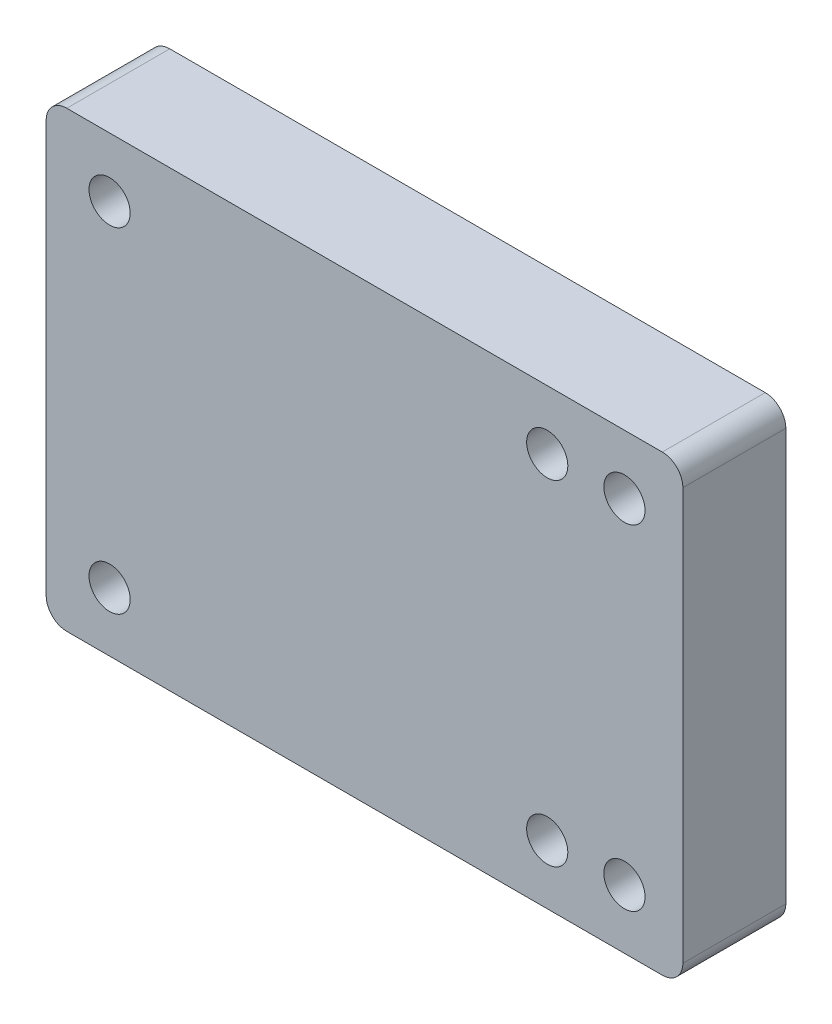
ISO-10303-21;
HEADER;
FILE_DESCRIPTION(('STEP AP214'),'2;1');
FILE_NAME('part.step','',(''),(''),'','','');
FILE_SCHEMA(('AUTOMOTIVE_DESIGN { 1 0 10303 214 1 1 1 1 }'));
ENDSEC;
DATA;
#1=APPLICATION_CONTEXT('core data for automotive mechanical design processes');
#2=APPLICATION_PROTOCOL_DEFINITION('international standard','automotive_design',2000,#1);
#3=PRODUCT_CONTEXT('',#1,'mechanical');
#4=PRODUCT('Part','Part','',(#3));
#5=PRODUCT_RELATED_PRODUCT_CATEGORY('part','',(#4));
#6=PRODUCT_DEFINITION_FORMATION('','',#4);
#7=PRODUCT_DEFINITION_CONTEXT('part definition',#1,'design');
#8=PRODUCT_DEFINITION('design','',#6,#7);
#9=PRODUCT_DEFINITION_SHAPE('','',#8);
#10=(LENGTH_UNIT() NAMED_UNIT(*) SI_UNIT(.MILLI.,.METRE.));
#11=(NAMED_UNIT(*) PLANE_ANGLE_UNIT() SI_UNIT($,.RADIAN.));
#12=(NAMED_UNIT(*) SI_UNIT($,.STERADIAN.) SOLID_ANGLE_UNIT());
#13=UNCERTAINTY_MEASURE_WITH_UNIT(LENGTH_MEASURE(1.E-05),#10,'distance_accuracy_value','');
#14=(GEOMETRIC_REPRESENTATION_CONTEXT(3) GLOBAL_UNCERTAINTY_ASSIGNED_CONTEXT((#13)) GLOBAL_UNIT_ASSIGNED_CONTEXT((#10,
#11,#12)) REPRESENTATION_CONTEXT('',''));
#15=CARTESIAN_POINT('',(0.,0.,0.));
#16=DIRECTION('',(0.,0.,1.));
#17=DIRECTION('',(1.,0.,0.));
#18=AXIS2_PLACEMENT_3D('',#15,#16,#17);
#19=CARTESIAN_POINT('',(4.85393581005026E-13,128.439999999993,12.7));
#20=DIRECTION('',(0.,-1.,0.));
#21=DIRECTION('',(1.,0.,0.));
#22=AXIS2_PLACEMENT_3D('',#19,#20,#21);
#23=PLANE('',#22);
#24=DIRECTION('',(-1.,0.,0.));
#25=VECTOR('',#24,1.);
#26=CARTESIAN_POINT('',(4.85393581005026E-13,128.439999999993,0.));
#27=LINE('',#26,#25);
#28=CARTESIAN_POINT('',(120.167455722645,128.439999999993,0.));
#29=VERTEX_POINT('',#28);
#30=CARTESIAN_POINT('',(46.7234244956583,128.439999999993,0.));
#31=VERTEX_POINT('',#30);
#32=EDGE_CURVE('E150',#29,#31,#27,.T.);
#33=ORIENTED_EDGE('',*,*,#32,.T.);
#34=DIRECTION('',(0.,0.,-1.));
#35=VECTOR('',#34,1.);
#36=CARTESIAN_POINT('',(46.7234244956583,128.439999999993,12.7));
#37=LINE('',#36,#35);
#38=CARTESIAN_POINT('',(46.7234244956583,128.439999999993,12.7));
#39=VERTEX_POINT('',#38);
#40=EDGE_CURVE('E11',#39,#31,#37,.T.);
#41=ORIENTED_EDGE('',*,*,#40,.F.);
#42=DIRECTION('',(-1.,0.,0.));
#43=VECTOR('',#42,1.);
#44=CARTESIAN_POINT('',(4.85393581005026E-13,128.439999999993,12.7));
#45=LINE('',#44,#43);
#46=CARTESIAN_POINT('',(120.167455722645,128.439999999993,12.7));
#47=VERTEX_POINT('',#46);
#48=EDGE_CURVE('E210',#47,#39,#45,.T.);
#49=ORIENTED_EDGE('',*,*,#48,.F.);
#50=DIRECTION('',(0.,0.,-1.));
#51=VECTOR('',#50,1.);
#52=CARTESIAN_POINT('',(120.167455722645,128.439999999993,12.7));
#53=LINE('',#52,#51);
#54=EDGE_CURVE('E128',#47,#29,#53,.T.);
#55=ORIENTED_EDGE('',*,*,#54,.T.);
#56=EDGE_LOOP('',(#33,#41,#49,#55));
#57=FACE_BOUND('',#56,.T.);
#58=ADVANCED_FACE('F35',(#57),#23,.F.);
#59=CARTESIAN_POINT('',(46.7234244956582,125.899999999993,12.7));
#60=DIRECTION('',(0.,0.,1.));
#61=DIRECTION('',(1.,0.,0.));
#62=AXIS2_PLACEMENT_3D('',#59,#60,#61);
#63=ELLIPSE('',#62,2.54348575883472,2.53999999999999);
#64=DIRECTION('',(0.,0.,-1.));
#65=VECTOR('',#64,1.);
#66=SURFACE_OF_LINEAR_EXTRUSION('',#63,#65);
#67=CARTESIAN_POINT('',(46.7234244956582,125.899999999993,0.));
#68=DIRECTION('',(0.,0.,1.));
#69=DIRECTION('',(1.,0.,0.));
#70=AXIS2_PLACEMENT_3D('',#67,#68,#69);
#71=ELLIPSE('',#70,2.54348575883472,2.53999999999999);
#72=CARTESIAN_POINT('',(44.1799387368235,125.899999999993,0.));
#73=VERTEX_POINT('',#72);
#74=EDGE_CURVE('E153',#31,#73,#71,.T.);
#75=ORIENTED_EDGE('',*,*,#74,.T.);
#76=DIRECTION('',(0.,0.,-1.));
#77=VECTOR('',#76,1.);
#78=CARTESIAN_POINT('',(44.1799387368235,125.899999999993,12.7));
#79=LINE('',#78,#77);
#80=CARTESIAN_POINT('',(44.1799387368235,125.899999999993,12.7));
#81=VERTEX_POINT('',#80);
#82=EDGE_CURVE('E44',#81,#73,#79,.T.);
#83=ORIENTED_EDGE('',*,*,#82,.F.);
#84=EDGE_CURVE('E95',#39,#81,#63,.T.);
#85=ORIENTED_EDGE('',*,*,#84,.F.);
#86=ORIENTED_EDGE('',*,*,#40,.T.);
#87=EDGE_LOOP('',(#75,#83,#85,#86));
#88=FACE_BOUND('',#87,.T.);
#89=ADVANCED_FACE('F180',(#88),#66,.F.);
#90=CARTESIAN_POINT('',(44.179938736823,-1.6897002779776E-13,12.7));
#91=DIRECTION('',(-1.,0.,0.));
#92=DIRECTION('',(0.,-1.,0.));
#93=AXIS2_PLACEMENT_3D('',#90,#91,#92);
#94=PLANE('',#93);
#95=DIRECTION('',(0.,1.,0.));
#96=VECTOR('',#95,1.);
#97=CARTESIAN_POINT('',(44.179938736823,-1.6897002779776E-13,0.));
#98=LINE('',#97,#96);
#99=CARTESIAN_POINT('',(44.1799387368233,75.0999999999933,0.));
#100=VERTEX_POINT('',#99);
#101=EDGE_CURVE('E156',#100,#73,#98,.T.);
#102=ORIENTED_EDGE('',*,*,#101,.F.);
#103=DIRECTION('',(0.,0.,-1.));
#104=VECTOR('',#103,1.);
#105=CARTESIAN_POINT('',(44.1799387368233,75.0999999999933,12.7));
#106=LINE('',#105,#104);
#107=CARTESIAN_POINT('',(44.1799387368233,75.0999999999933,12.7));
#108=VERTEX_POINT('',#107);
#109=EDGE_CURVE('E173',#108,#100,#106,.T.);
#110=ORIENTED_EDGE('',*,*,#109,.F.);
#111=DIRECTION('',(0.,1.,0.));
#112=VECTOR('',#111,1.);
#113=CARTESIAN_POINT('',(44.179938736823,-1.6897002779776E-13,12.7));
#114=LINE('',#113,#112);
#115=EDGE_CURVE('E179',#108,#81,#114,.T.);
#116=ORIENTED_EDGE('',*,*,#115,.T.);
#117=ORIENTED_EDGE('',*,*,#82,.T.);
#118=EDGE_LOOP('',(#102,#110,#116,#117));
#119=FACE_BOUND('',#118,.T.);
#120=ADVANCED_FACE('F177',(#119),#94,.T.);
#121=CARTESIAN_POINT('',(46.7234244956581,75.0999999999933,12.7));
#122=DIRECTION('',(0.,0.,1.));
#123=DIRECTION('',(1.,0.,0.));
#124=AXIS2_PLACEMENT_3D('',#121,#122,#123);
#125=ELLIPSE('',#124,2.54348575883472,2.54);
#126=DIRECTION('',(0.,0.,-1.));
#127=VECTOR('',#126,1.);
#128=SURFACE_OF_LINEAR_EXTRUSION('',#125,#127);
#129=CARTESIAN_POINT('',(46.7234244956581,75.0999999999933,0.));
#130=DIRECTION('',(0.,0.,1.));
#131=DIRECTION('',(1.,0.,0.));
#132=AXIS2_PLACEMENT_3D('',#129,#130,#131);
#133=ELLIPSE('',#132,2.54348575883472,2.54);
#134=CARTESIAN_POINT('',(46.723424495658,72.5599999999933,0.));
#135=VERTEX_POINT('',#134);
#136=EDGE_CURVE('E159',#100,#135,#133,.T.);
#137=ORIENTED_EDGE('',*,*,#136,.T.);
#138=DIRECTION('',(0.,0.,-1.));
#139=VECTOR('',#138,1.);
#140=CARTESIAN_POINT('',(46.723424495658,72.5599999999933,12.7));
#141=LINE('',#140,#139);
#142=CARTESIAN_POINT('',(46.723424495658,72.5599999999933,12.7));
#143=VERTEX_POINT('',#142);
#144=EDGE_CURVE('E170',#143,#135,#141,.T.);
#145=ORIENTED_EDGE('',*,*,#144,.F.);
#146=EDGE_CURVE('E193',#108,#143,#125,.T.);
#147=ORIENTED_EDGE('',*,*,#146,.F.);
#148=ORIENTED_EDGE('',*,*,#109,.T.);
#149=EDGE_LOOP('',(#137,#145,#147,#148));
#150=FACE_BOUND('',#149,.T.);
#151=ADVANCED_FACE('F189',(#150),#128,.F.);
#152=CARTESIAN_POINT('',(2.87925616238006E-13,72.5599999999934,12.7));
#153=DIRECTION('',(0.,1.,0.));
#154=DIRECTION('',(-1.,0.,0.));
#155=AXIS2_PLACEMENT_3D('',#152,#153,#154);
#156=PLANE('',#155);
#157=DIRECTION('',(1.,0.,0.));
#158=VECTOR('',#157,1.);
#159=CARTESIAN_POINT('',(2.87925616238006E-13,72.5599999999934,0.));
#160=LINE('',#159,#158);
#161=CARTESIAN_POINT('',(120.167455722645,72.559999999993,0.));
#162=VERTEX_POINT('',#161);
#163=EDGE_CURVE('E161',#135,#162,#160,.T.);
#164=ORIENTED_EDGE('',*,*,#163,.T.);
#165=DIRECTION('',(0.,0.,-1.));
#166=VECTOR('',#165,1.);
#167=CARTESIAN_POINT('',(120.167455722645,72.559999999993,12.7));
#168=LINE('',#167,#166);
#169=CARTESIAN_POINT('',(120.167455722645,72.559999999993,12.7));
#170=VERTEX_POINT('',#169);
#171=EDGE_CURVE('E123',#170,#162,#168,.T.);
#172=ORIENTED_EDGE('',*,*,#171,.F.);
#173=DIRECTION('',(1.,0.,0.));
#174=VECTOR('',#173,1.);
#175=CARTESIAN_POINT('',(2.87925616238006E-13,72.5599999999934,12.7));
#176=LINE('',#175,#174);
#177=EDGE_CURVE('E114',#143,#170,#176,.T.);
#178=ORIENTED_EDGE('',*,*,#177,.F.);
#179=ORIENTED_EDGE('',*,*,#144,.T.);
#180=EDGE_LOOP('',(#164,#172,#178,#179));
#181=FACE_BOUND('',#180,.T.);
#182=ADVANCED_FACE('F192',(#181),#156,.F.);
#183=CARTESIAN_POINT('',(120.167455722645,75.099999999993,12.7));
#184=DIRECTION('',(0.,0.,-1.));
#185=DIRECTION('',(-1.,0.,0.));
#186=AXIS2_PLACEMENT_3D('',#183,#184,#185);
#187=CYLINDRICAL_SURFACE('',#186,2.54000000000001);
#188=CARTESIAN_POINT('',(120.167455722645,75.099999999993,0.));
#189=DIRECTION('',(0.,0.,1.));
#190=DIRECTION('',(1.,0.,0.));
#191=AXIS2_PLACEMENT_3D('',#188,#189,#190);
#192=CIRCLE('',#191,2.54000000000001);
#193=CARTESIAN_POINT('',(122.707455722645,75.0999999999929,0.));
#194=VERTEX_POINT('',#193);
#195=EDGE_CURVE('E122',#162,#194,#192,.T.);
#196=ORIENTED_EDGE('',*,*,#195,.T.);
#197=DIRECTION('',(0.,0.,-1.));
#198=VECTOR('',#197,1.);
#199=CARTESIAN_POINT('',(122.707455722645,75.0999999999929,12.7));
#200=LINE('',#199,#198);
#201=CARTESIAN_POINT('',(122.707455722645,75.0999999999929,12.7));
#202=VERTEX_POINT('',#201);
#203=EDGE_CURVE('E119',#202,#194,#200,.T.);
#204=ORIENTED_EDGE('',*,*,#203,.F.);
#205=CARTESIAN_POINT('',(120.167455722645,75.099999999993,12.7));
#206=DIRECTION('',(0.,0.,1.));
#207=DIRECTION('',(1.,0.,0.));
#208=AXIS2_PLACEMENT_3D('',#205,#206,#207);
#209=CIRCLE('',#208,2.54000000000001);
#210=EDGE_CURVE('E108',#170,#202,#209,.T.);
#211=ORIENTED_EDGE('',*,*,#210,.F.);
#212=ORIENTED_EDGE('',*,*,#171,.T.);
#213=EDGE_LOOP('',(#196,#204,#211,#212));
#214=FACE_BOUND('',#213,.T.);
#215=ADVANCED_FACE('F120',(#214),#187,.T.);
#216=CARTESIAN_POINT('',(122.707455722644,-4.69305363412973E-13,12.7));
#217=DIRECTION('',(-1.,0.,0.));
#218=DIRECTION('',(0.,-1.,0.));
#219=AXIS2_PLACEMENT_3D('',#216,#217,#218);
#220=PLANE('',#219);
#221=DIRECTION('',(0.,1.,0.));
#222=VECTOR('',#221,1.);
#223=CARTESIAN_POINT('',(122.707455722644,-4.69305363412973E-13,0.));
#224=LINE('',#223,#222);
#225=CARTESIAN_POINT('',(122.707455722645,125.899999999993,0.));
#226=VERTEX_POINT('',#225);
#227=EDGE_CURVE('E81',#194,#226,#224,.T.);
#228=ORIENTED_EDGE('',*,*,#227,.T.);
#229=DIRECTION('',(0.,0.,-1.));
#230=VECTOR('',#229,1.);
#231=CARTESIAN_POINT('',(122.707455722645,125.899999999993,12.7));
#232=LINE('',#231,#230);
#233=CARTESIAN_POINT('',(122.707455722645,125.899999999993,12.7));
#234=VERTEX_POINT('',#233);
#235=EDGE_CURVE('E124',#234,#226,#232,.T.);
#236=ORIENTED_EDGE('',*,*,#235,.F.);
#237=DIRECTION('',(0.,1.,0.));
#238=VECTOR('',#237,1.);
#239=CARTESIAN_POINT('',(122.707455722644,-4.69305363412973E-13,12.7));
#240=LINE('',#239,#238);
#241=EDGE_CURVE('E112',#202,#234,#240,.T.);
#242=ORIENTED_EDGE('',*,*,#241,.F.);
#243=ORIENTED_EDGE('',*,*,#203,.T.);
#244=EDGE_LOOP('',(#228,#236,#242,#243));
#245=FACE_BOUND('',#244,.T.);
#246=ADVANCED_FACE('F126',(#245),#220,.F.);
#247=CARTESIAN_POINT('',(52.0031387368233,79.8624999999932,12.7));
#248=DIRECTION('',(0.,0.,-1.));
#249=DIRECTION('',(-1.,0.,0.));
#250=AXIS2_PLACEMENT_3D('',#247,#248,#249);
#251=CYLINDRICAL_SURFACE('',#250,2.54);
#252=CARTESIAN_POINT('',(52.0031387368233,79.8624999999932,12.7));
#253=DIRECTION('',(0.,0.,1.));
#254=DIRECTION('',(1.,0.,0.));
#255=AXIS2_PLACEMENT_3D('',#252,#253,#254);
#256=CIRCLE('',#255,2.54);
#257=CARTESIAN_POINT('',(54.5431387368233,79.8624999999932,12.7));
#258=VERTEX_POINT('',#257);
#259=EDGE_CURVE('E212',#258,#258,#256,.T.);
#260=ORIENTED_EDGE('',*,*,#259,.T.);
#261=EDGE_LOOP('',(#260));
#262=FACE_BOUND('',#261,.T.);
#263=CARTESIAN_POINT('',(52.0031387368233,79.8624999999932,0.));
#264=DIRECTION('',(0.,0.,1.));
#265=DIRECTION('',(1.,0.,0.));
#266=AXIS2_PLACEMENT_3D('',#263,#264,#265);
#267=CIRCLE('',#266,2.54);
#268=CARTESIAN_POINT('',(54.5431387368233,79.8624999999932,0.));
#269=VERTEX_POINT('',#268);
#270=EDGE_CURVE('E147',#269,#269,#267,.T.);
#271=ORIENTED_EDGE('',*,*,#270,.F.);
#272=EDGE_LOOP('',(#271));
#273=FACE_BOUND('',#272,.T.);
#274=ADVANCED_FACE('F246',(#262,#273),#251,.F.);
#275=CARTESIAN_POINT('',(52.0031387368235,121.137499999993,12.7));
#276=DIRECTION('',(0.,0.,-1.));
#277=DIRECTION('',(-1.,0.,0.));
#278=AXIS2_PLACEMENT_3D('',#275,#276,#277);
#279=CYLINDRICAL_SURFACE('',#278,2.53999999999999);
#280=CARTESIAN_POINT('',(52.0031387368235,121.137499999993,12.7));
#281=DIRECTION('',(0.,0.,1.));
#282=DIRECTION('',(1.,0.,0.));
#283=AXIS2_PLACEMENT_3D('',#280,#281,#282);
#284=CIRCLE('',#283,2.53999999999999);
#285=CARTESIAN_POINT('',(54.5431387368235,121.137499999993,12.7));
#286=VERTEX_POINT('',#285);
#287=EDGE_CURVE('E215',#286,#286,#284,.T.);
#288=ORIENTED_EDGE('',*,*,#287,.T.);
#289=EDGE_LOOP('',(#288));
#290=FACE_BOUND('',#289,.T.);
#291=CARTESIAN_POINT('',(52.0031387368235,121.137499999993,0.));
#292=DIRECTION('',(0.,0.,1.));
#293=DIRECTION('',(1.,0.,0.));
#294=AXIS2_PLACEMENT_3D('',#291,#292,#293);
#295=CIRCLE('',#294,2.53999999999999);
#296=CARTESIAN_POINT('',(54.5431387368235,121.137499999993,0.));
#297=VERTEX_POINT('',#296);
#298=EDGE_CURVE('E144',#297,#297,#295,.T.);
#299=ORIENTED_EDGE('',*,*,#298,.F.);
#300=EDGE_LOOP('',(#299));
#301=FACE_BOUND('',#300,.T.);
#302=ADVANCED_FACE('F249',(#290,#301),#279,.F.);
#303=CARTESIAN_POINT('',(105.978138736823,121.137499999993,12.7));
#304=DIRECTION('',(0.,0.,-1.));
#305=DIRECTION('',(-1.,0.,0.));
#306=AXIS2_PLACEMENT_3D('',#303,#304,#305);
#307=CYLINDRICAL_SURFACE('',#306,2.53999999999999);
#308=CARTESIAN_POINT('',(105.978138736823,121.137499999993,12.7));
#309=DIRECTION('',(0.,0.,1.));
#310=DIRECTION('',(1.,0.,0.));
#311=AXIS2_PLACEMENT_3D('',#308,#309,#310);
#312=CIRCLE('',#311,2.53999999999999);
#313=CARTESIAN_POINT('',(108.518138736823,121.137499999993,12.7));
#314=VERTEX_POINT('',#313);
#315=EDGE_CURVE('E218',#314,#314,#312,.T.);
#316=ORIENTED_EDGE('',*,*,#315,.T.);
#317=EDGE_LOOP('',(#316));
#318=FACE_BOUND('',#317,.T.);
#319=CARTESIAN_POINT('',(105.978138736823,121.137499999993,0.));
#320=DIRECTION('',(0.,0.,1.));
#321=DIRECTION('',(1.,0.,0.));
#322=AXIS2_PLACEMENT_3D('',#319,#320,#321);
#323=CIRCLE('',#322,2.53999999999999);
#324=CARTESIAN_POINT('',(108.518138736823,121.137499999993,0.));
#325=VERTEX_POINT('',#324);
#326=EDGE_CURVE('E141',#325,#325,#323,.T.);
#327=ORIENTED_EDGE('',*,*,#326,.F.);
#328=EDGE_LOOP('',(#327));
#329=FACE_BOUND('',#328,.T.);
#330=ADVANCED_FACE('F341',(#318,#329),#307,.F.);
#331=CARTESIAN_POINT('',(115.503138736824,121.137499999993,12.7));
#332=DIRECTION('',(0.,0.,-1.));
#333=DIRECTION('',(-1.,0.,0.));
#334=AXIS2_PLACEMENT_3D('',#331,#332,#333);
#335=CYLINDRICAL_SURFACE('',#334,2.54000000000001);
#336=CARTESIAN_POINT('',(115.503138736824,121.137499999993,12.7));
#337=DIRECTION('',(0.,0.,1.));
#338=DIRECTION('',(1.,0.,0.));
#339=AXIS2_PLACEMENT_3D('',#336,#337,#338);
#340=CIRCLE('',#339,2.54000000000001);
#341=CARTESIAN_POINT('',(118.043138736824,121.137499999993,12.7));
#342=VERTEX_POINT('',#341);
#343=EDGE_CURVE('E221',#342,#342,#340,.T.);
#344=ORIENTED_EDGE('',*,*,#343,.T.);
#345=EDGE_LOOP('',(#344));
#346=FACE_BOUND('',#345,.T.);
#347=CARTESIAN_POINT('',(115.503138736824,121.137499999993,0.));
#348=DIRECTION('',(0.,0.,1.));
#349=DIRECTION('',(1.,0.,0.));
#350=AXIS2_PLACEMENT_3D('',#347,#348,#349);
#351=CIRCLE('',#350,2.54000000000001);
#352=CARTESIAN_POINT('',(118.043138736824,121.137499999993,0.));
#353=VERTEX_POINT('',#352);
#354=EDGE_CURVE('E138',#353,#353,#351,.T.);
#355=ORIENTED_EDGE('',*,*,#354,.F.);
#356=EDGE_LOOP('',(#355));
#357=FACE_BOUND('',#356,.T.);
#358=ADVANCED_FACE('F350',(#346,#357),#335,.F.);
#359=CARTESIAN_POINT('',(115.503138736823,79.862499999993,12.7));
#360=DIRECTION('',(0.,0.,-1.));
#361=DIRECTION('',(-1.,0.,0.));
#362=AXIS2_PLACEMENT_3D('',#359,#360,#361);
#363=CYLINDRICAL_SURFACE('',#362,2.53999999999998);
#364=CARTESIAN_POINT('',(115.503138736823,79.862499999993,12.7));
#365=DIRECTION('',(0.,0.,1.));
#366=DIRECTION('',(1.,0.,0.));
#367=AXIS2_PLACEMENT_3D('',#364,#365,#366);
#368=CIRCLE('',#367,2.53999999999998);
#369=CARTESIAN_POINT('',(118.043138736823,79.862499999993,12.7));
#370=VERTEX_POINT('',#369);
#371=EDGE_CURVE('E224',#370,#370,#368,.T.);
#372=ORIENTED_EDGE('',*,*,#371,.T.);
#373=EDGE_LOOP('',(#372));
#374=FACE_BOUND('',#373,.T.);
#375=CARTESIAN_POINT('',(115.503138736823,79.862499999993,0.));
#376=DIRECTION('',(0.,0.,1.));
#377=DIRECTION('',(1.,0.,0.));
#378=AXIS2_PLACEMENT_3D('',#375,#376,#377);
#379=CIRCLE('',#378,2.53999999999998);
#380=CARTESIAN_POINT('',(118.043138736823,79.862499999993,0.));
#381=VERTEX_POINT('',#380);
#382=EDGE_CURVE('E135',#381,#381,#379,.T.);
#383=ORIENTED_EDGE('',*,*,#382,.F.);
#384=EDGE_LOOP('',(#383));
#385=FACE_BOUND('',#384,.T.);
#386=ADVANCED_FACE('F268',(#374,#385),#363,.F.);
#387=CARTESIAN_POINT('',(105.978138736823,79.862499999993,12.7));
#388=DIRECTION('',(0.,0.,-1.));
#389=DIRECTION('',(-1.,0.,0.));
#390=AXIS2_PLACEMENT_3D('',#387,#388,#389);
#391=CYLINDRICAL_SURFACE('',#390,2.53999999999999);
#392=CARTESIAN_POINT('',(105.978138736823,79.862499999993,12.7));
#393=DIRECTION('',(0.,0.,1.));
#394=DIRECTION('',(1.,0.,0.));
#395=AXIS2_PLACEMENT_3D('',#392,#393,#394);
#396=CIRCLE('',#395,2.53999999999999);
#397=CARTESIAN_POINT('',(108.518138736823,79.862499999993,12.7));
#398=VERTEX_POINT('',#397);
#399=EDGE_CURVE('E166',#398,#398,#396,.T.);
#400=ORIENTED_EDGE('',*,*,#399,.T.);
#401=EDGE_LOOP('',(#400));
#402=FACE_BOUND('',#401,.T.);
#403=CARTESIAN_POINT('',(105.978138736823,79.862499999993,0.));
#404=DIRECTION('',(0.,0.,1.));
#405=DIRECTION('',(1.,0.,0.));
#406=AXIS2_PLACEMENT_3D('',#403,#404,#405);
#407=CIRCLE('',#406,2.53999999999999);
#408=CARTESIAN_POINT('',(108.518138736823,79.862499999993,0.));
#409=VERTEX_POINT('',#408);
#410=EDGE_CURVE('E132',#409,#409,#407,.T.);
#411=ORIENTED_EDGE('',*,*,#410,.F.);
#412=EDGE_LOOP('',(#411));
#413=FACE_BOUND('',#412,.T.);
#414=ADVANCED_FACE('F37',(#402,#413),#391,.F.);
#415=CARTESIAN_POINT('',(120.167455722645,125.899999999993,12.7));
#416=DIRECTION('',(0.,0.,-1.));
#417=DIRECTION('',(-1.,0.,0.));
#418=AXIS2_PLACEMENT_3D('',#415,#416,#417);
#419=CYLINDRICAL_SURFACE('',#418,2.54000000000001);
#420=CARTESIAN_POINT('',(120.167455722645,125.899999999993,0.));
#421=DIRECTION('',(0.,0.,1.));
#422=DIRECTION('',(1.,0.,0.));
#423=AXIS2_PLACEMENT_3D('',#420,#421,#422);
#424=CIRCLE('',#423,2.54000000000001);
#425=EDGE_CURVE('E87',#226,#29,#424,.T.);
#426=ORIENTED_EDGE('',*,*,#425,.T.);
#427=ORIENTED_EDGE('',*,*,#54,.F.);
#428=CARTESIAN_POINT('',(120.167455722645,125.899999999993,12.7));
#429=DIRECTION('',(0.,0.,1.));
#430=DIRECTION('',(1.,0.,0.));
#431=AXIS2_PLACEMENT_3D('',#428,#429,#430);
#432=CIRCLE('',#431,2.54000000000001);
#433=EDGE_CURVE('E52',#234,#47,#432,.T.);
#434=ORIENTED_EDGE('',*,*,#433,.F.);
#435=ORIENTED_EDGE('',*,*,#235,.T.);
#436=EDGE_LOOP('',(#426,#427,#434,#435));
#437=FACE_BOUND('',#436,.T.);
#438=ADVANCED_FACE('F234',(#437),#419,.T.);
#439=CARTESIAN_POINT('',(0.,0.,12.7));
#440=DIRECTION('',(0.,0.,1.));
#441=DIRECTION('',(1.,0.,0.));
#442=AXIS2_PLACEMENT_3D('',#439,#440,#441);
#443=PLANE('',#442);
#444=ORIENTED_EDGE('',*,*,#399,.F.);
#445=EDGE_LOOP('',(#444));
#446=FACE_BOUND('',#445,.T.);
#447=ORIENTED_EDGE('',*,*,#371,.F.);
#448=EDGE_LOOP('',(#447));
#449=FACE_BOUND('',#448,.T.);
#450=ORIENTED_EDGE('',*,*,#343,.F.);
#451=EDGE_LOOP('',(#450));
#452=FACE_BOUND('',#451,.T.);
#453=ORIENTED_EDGE('',*,*,#315,.F.);
#454=EDGE_LOOP('',(#453));
#455=FACE_BOUND('',#454,.T.);
#456=ORIENTED_EDGE('',*,*,#287,.F.);
#457=EDGE_LOOP('',(#456));
#458=FACE_BOUND('',#457,.T.);
#459=ORIENTED_EDGE('',*,*,#259,.F.);
#460=EDGE_LOOP('',(#459));
#461=FACE_BOUND('',#460,.T.);
#462=ORIENTED_EDGE('',*,*,#48,.T.);
#463=ORIENTED_EDGE('',*,*,#84,.T.);
#464=ORIENTED_EDGE('',*,*,#115,.F.);
#465=ORIENTED_EDGE('',*,*,#146,.T.);
#466=ORIENTED_EDGE('',*,*,#177,.T.);
#467=ORIENTED_EDGE('',*,*,#210,.T.);
#468=ORIENTED_EDGE('',*,*,#241,.T.);
#469=ORIENTED_EDGE('',*,*,#433,.T.);
#470=EDGE_LOOP('',(#462,#463,#464,#465,#466,#467,#468,#469));
#471=FACE_BOUND('',#470,.T.);
#472=ADVANCED_FACE('F110',(#446,#449,#452,#455,#458,#461,#471),#443,.T.);
#473=CARTESIAN_POINT('',(0.,0.,0.));
#474=DIRECTION('',(0.,0.,1.));
#475=DIRECTION('',(1.,0.,0.));
#476=AXIS2_PLACEMENT_3D('',#473,#474,#475);
#477=PLANE('',#476);
#478=ORIENTED_EDGE('',*,*,#410,.T.);
#479=EDGE_LOOP('',(#478));
#480=FACE_BOUND('',#479,.T.);
#481=ORIENTED_EDGE('',*,*,#382,.T.);
#482=EDGE_LOOP('',(#481));
#483=FACE_BOUND('',#482,.T.);
#484=ORIENTED_EDGE('',*,*,#354,.T.);
#485=EDGE_LOOP('',(#484));
#486=FACE_BOUND('',#485,.T.);
#487=ORIENTED_EDGE('',*,*,#326,.T.);
#488=EDGE_LOOP('',(#487));
#489=FACE_BOUND('',#488,.T.);
#490=ORIENTED_EDGE('',*,*,#298,.T.);
#491=EDGE_LOOP('',(#490));
#492=FACE_BOUND('',#491,.T.);
#493=ORIENTED_EDGE('',*,*,#270,.T.);
#494=EDGE_LOOP('',(#493));
#495=FACE_BOUND('',#494,.T.);
#496=ORIENTED_EDGE('',*,*,#32,.F.);
#497=ORIENTED_EDGE('',*,*,#425,.F.);
#498=ORIENTED_EDGE('',*,*,#227,.F.);
#499=ORIENTED_EDGE('',*,*,#195,.F.);
#500=ORIENTED_EDGE('',*,*,#163,.F.);
#501=ORIENTED_EDGE('',*,*,#136,.F.);
#502=ORIENTED_EDGE('',*,*,#101,.T.);
#503=ORIENTED_EDGE('',*,*,#74,.F.);
#504=EDGE_LOOP('',(#496,#497,#498,#499,#500,#501,#502,#503));
#505=FACE_BOUND('',#504,.T.);
#506=ADVANCED_FACE('F185',(#480,#483,#486,#489,#492,#495,#505),#477,.F.);
#507=CLOSED_SHELL('',(#58,#89,#120,#151,#182,#215,#246,#274,#302,#330,#358,#386,#414,#438,#472,#506));
#508=MANIFOLD_SOLID_BREP('B2',#507);
#509=ADVANCED_BREP_SHAPE_REPRESENTATION('',(#18,#508),#14);
#510=SHAPE_DEFINITION_REPRESENTATION(#9,#509);
ENDSEC;
END-ISO-10303-21;
